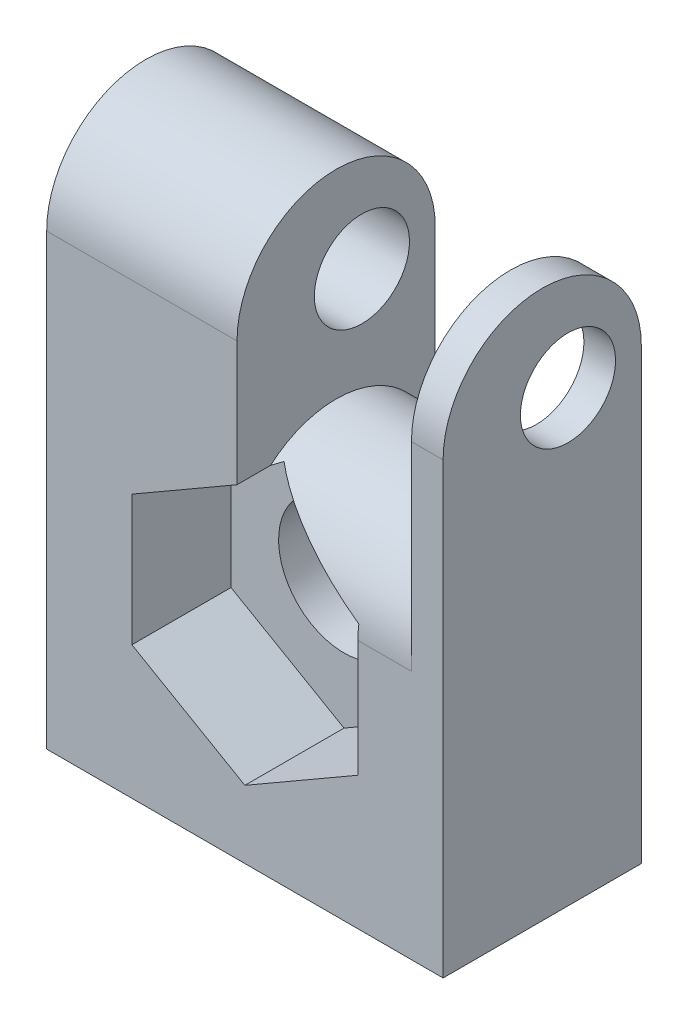
ISO-10303-21;
HEADER;
FILE_DESCRIPTION(('STEP AP214'),'2;1');
FILE_NAME('part.step','',(''),(''),'','','');
FILE_SCHEMA(('AUTOMOTIVE_DESIGN { 1 0 10303 214 1 1 1 1 }'));
ENDSEC;
DATA;
#1=APPLICATION_CONTEXT('core data for automotive mechanical design processes');
#2=APPLICATION_PROTOCOL_DEFINITION('international standard','automotive_design',2000,#1);
#3=PRODUCT_CONTEXT('',#1,'mechanical');
#4=PRODUCT('Part','Part','',(#3));
#5=PRODUCT_RELATED_PRODUCT_CATEGORY('part','',(#4));
#6=PRODUCT_DEFINITION_FORMATION('','',#4);
#7=PRODUCT_DEFINITION_CONTEXT('part definition',#1,'design');
#8=PRODUCT_DEFINITION('design','',#6,#7);
#9=PRODUCT_DEFINITION_SHAPE('','',#8);
#10=(LENGTH_UNIT() NAMED_UNIT(*) SI_UNIT(.MILLI.,.METRE.));
#11=(NAMED_UNIT(*) PLANE_ANGLE_UNIT() SI_UNIT($,.RADIAN.));
#12=(NAMED_UNIT(*) SI_UNIT($,.STERADIAN.) SOLID_ANGLE_UNIT());
#13=UNCERTAINTY_MEASURE_WITH_UNIT(LENGTH_MEASURE(1.E-05),#10,'distance_accuracy_value','');
#14=(GEOMETRIC_REPRESENTATION_CONTEXT(3) GLOBAL_UNCERTAINTY_ASSIGNED_CONTEXT((#13)) GLOBAL_UNIT_ASSIGNED_CONTEXT((#10,
#11,#12)) REPRESENTATION_CONTEXT('',''));
#15=CARTESIAN_POINT('',(0.,0.,0.));
#16=DIRECTION('',(0.,0.,1.));
#17=DIRECTION('',(1.,0.,0.));
#18=AXIS2_PLACEMENT_3D('',#15,#16,#17);
#19=CARTESIAN_POINT('',(0.,0.,0.));
#20=DIRECTION('',(0.,0.,1.));
#21=DIRECTION('',(1.,0.,0.));
#22=AXIS2_PLACEMENT_3D('',#19,#20,#21);
#23=PLANE('',#22);
#24=DIRECTION('',(1.,0.,0.));
#25=VECTOR('',#24,1.);
#26=CARTESIAN_POINT('',(-11.2233690098318,58.061458727347,0.));
#27=LINE('',#26,#25);
#28=CARTESIAN_POINT('',(-0.980271521811472,58.061458727347,0.));
#29=VERTEX_POINT('',#28);
#30=CARTESIAN_POINT('',(2.2051148585505,58.061458727347,0.));
#31=VERTEX_POINT('',#30);
#32=EDGE_CURVE('E285',#29,#31,#27,.T.);
#33=ORIENTED_EDGE('',*,*,#32,.T.);
#34=DIRECTION('',(0.,-1.,0.));
#35=VECTOR('',#34,1.);
#36=CARTESIAN_POINT('',(2.20511485855051,0.,0.));
#37=LINE('',#36,#35);
#38=CARTESIAN_POINT('',(2.2051148585505,63.0790062637207,0.));
#39=VERTEX_POINT('',#38);
#40=EDGE_CURVE('E284',#39,#31,#37,.T.);
#41=ORIENTED_EDGE('',*,*,#40,.F.);
#42=DIRECTION('',(1.,0.,0.));
#43=VECTOR('',#42,1.);
#44=CARTESIAN_POINT('',(-13.2871522145955,63.0790062637207,0.));
#45=LINE('',#44,#43);
#46=CARTESIAN_POINT('',(3.00360840654345,63.0790062637207,0.));
#47=VERTEX_POINT('',#46);
#48=EDGE_CURVE('E255',#39,#47,#45,.T.);
#49=ORIENTED_EDGE('',*,*,#48,.T.);
#50=DIRECTION('',(0.,1.,0.));
#51=VECTOR('',#50,1.);
#52=CARTESIAN_POINT('',(3.00360840654345,0.,0.));
#53=LINE('',#52,#51);
#54=CARTESIAN_POINT('',(3.00360840654345,51.761458727347,0.));
#55=VERTEX_POINT('',#54);
#56=EDGE_CURVE('E189',#55,#47,#53,.T.);
#57=ORIENTED_EDGE('',*,*,#56,.F.);
#58=DIRECTION('',(-1.,0.,0.));
#59=VECTOR('',#58,1.);
#60=CARTESIAN_POINT('',(0.,51.761458727347,0.));
#61=LINE('',#60,#59);
#62=CARTESIAN_POINT('',(-6.99639159345655,51.761458727347,0.));
#63=VERTEX_POINT('',#62);
#64=EDGE_CURVE('E180',#55,#63,#61,.T.);
#65=ORIENTED_EDGE('',*,*,#64,.T.);
#66=DIRECTION('',(0.,1.,0.));
#67=VECTOR('',#66,1.);
#68=CARTESIAN_POINT('',(-6.99639159345655,0.,0.));
#69=LINE('',#68,#67);
#70=CARTESIAN_POINT('',(-6.99639159345655,63.0790062637207,0.));
#71=VERTEX_POINT('',#70);
#72=EDGE_CURVE('E177',#63,#71,#69,.T.);
#73=ORIENTED_EDGE('',*,*,#72,.T.);
#74=CARTESIAN_POINT('',(-2.19488514144951,63.0790062637207,0.));
#75=VERTEX_POINT('',#74);
#76=EDGE_CURVE('E184',#71,#75,#45,.T.);
#77=ORIENTED_EDGE('',*,*,#76,.T.);
#78=DIRECTION('',(0.,-1.,0.));
#79=VECTOR('',#78,1.);
#80=CARTESIAN_POINT('',(-2.1948851414495,0.,0.));
#81=LINE('',#80,#79);
#82=CARTESIAN_POINT('',(-2.19488514144951,58.3994759163304,0.));
#83=VERTEX_POINT('',#82);
#84=EDGE_CURVE('E156',#75,#83,#81,.T.);
#85=ORIENTED_EDGE('',*,*,#84,.T.);
#86=CARTESIAN_POINT('',(-1.99639159345654,56.761458727347,0.));
#87=DIRECTION('',(0.,0.,1.));
#88=DIRECTION('',(1.,0.,0.));
#89=AXIS2_PLACEMENT_3D('',#86,#87,#88);
#90=CIRCLE('',#89,1.65);
#91=EDGE_CURVE('E225',#83,#29,#90,.T.);
#92=ORIENTED_EDGE('',*,*,#91,.T.);
#93=EDGE_LOOP('',(#33,#41,#49,#57,#65,#73,#77,#85,#92));
#94=FACE_BOUND('',#93,.T.);
#95=ADVANCED_FACE('F37',(#94),#23,.F.);
#96=CARTESIAN_POINT('',(0.,0.,5.));
#97=DIRECTION('',(0.,0.,1.));
#98=DIRECTION('',(1.,0.,0.));
#99=AXIS2_PLACEMENT_3D('',#96,#97,#98);
#100=PLANE('',#99);
#101=DIRECTION('',(0.,1.,0.));
#102=VECTOR('',#101,1.);
#103=CARTESIAN_POINT('',(2.2051148585505,63.0790062637212,5.));
#104=LINE('',#103,#102);
#105=CARTESIAN_POINT('',(2.2051148585505,58.061458727347,5.));
#106=VERTEX_POINT('',#105);
#107=CARTESIAN_POINT('',(2.2051148585505,63.0790062637207,5.));
#108=VERTEX_POINT('',#107);
#109=EDGE_CURVE('E259',#106,#108,#104,.T.);
#110=ORIENTED_EDGE('',*,*,#109,.F.);
#111=DIRECTION('',(1.,0.,0.));
#112=VECTOR('',#111,1.);
#113=CARTESIAN_POINT('',(-11.2233690098318,58.061458727347,5.));
#114=LINE('',#113,#112);
#115=CARTESIAN_POINT('',(0.853608406543471,58.061458727347,5.));
#116=VERTEX_POINT('',#115);
#117=EDGE_CURVE('E263',#116,#106,#114,.T.);
#118=ORIENTED_EDGE('',*,*,#117,.F.);
#119=DIRECTION('',(0.,1.,0.));
#120=VECTOR('',#119,1.);
#121=CARTESIAN_POINT('',(0.853608406543471,0.,5.));
#122=LINE('',#121,#120);
#123=CARTESIAN_POINT('',(0.853608406543471,55.1160104601566,5.));
#124=VERTEX_POINT('',#123);
#125=EDGE_CURVE('E202',#124,#116,#122,.T.);
#126=ORIENTED_EDGE('',*,*,#125,.F.);
#127=DIRECTION('',(0.866025403784439,0.5,0.));
#128=VECTOR('',#127,1.);
#129=CARTESIAN_POINT('',(-23.6525305052363,40.9673845626421,5.));
#130=LINE('',#129,#128);
#131=CARTESIAN_POINT('',(-1.99639159345654,53.4705621929661,5.));
#132=VERTEX_POINT('',#131);
#133=EDGE_CURVE('E205',#132,#124,#130,.T.);
#134=ORIENTED_EDGE('',*,*,#133,.F.);
#135=DIRECTION('',(0.866025403784439,-0.499999999999999,0.));
#136=VECTOR('',#135,1.);
#137=CARTESIAN_POINT('',(22.6543347085081,39.2384587268071,5.));
#138=LINE('',#137,#136);
#139=CARTESIAN_POINT('',(-4.84639159345655,55.1160104601566,5.));
#140=VERTEX_POINT('',#139);
#141=EDGE_CURVE('E195',#140,#132,#138,.T.);
#142=ORIENTED_EDGE('',*,*,#141,.F.);
#143=DIRECTION('',(0.,-1.,0.));
#144=VECTOR('',#143,1.);
#145=CARTESIAN_POINT('',(-4.84639159345655,0.,5.));
#146=LINE('',#145,#144);
#147=CARTESIAN_POINT('',(-4.84639159345655,58.4069069945374,5.));
#148=VERTEX_POINT('',#147);
#149=EDGE_CURVE('E198',#148,#140,#146,.T.);
#150=ORIENTED_EDGE('',*,*,#149,.F.);
#151=DIRECTION('',(-0.866025403784438,-0.5,0.));
#152=VECTOR('',#151,1.);
#153=CARTESIAN_POINT('',(-26.5025305052364,45.9037293642134,5.));
#154=LINE('',#153,#152);
#155=CARTESIAN_POINT('',(-2.19488514144951,59.9377549583617,5.));
#156=VERTEX_POINT('',#155);
#157=EDGE_CURVE('E169',#156,#148,#154,.T.);
#158=ORIENTED_EDGE('',*,*,#157,.F.);
#159=DIRECTION('',(0.,1.,0.));
#160=VECTOR('',#159,1.);
#161=CARTESIAN_POINT('',(-2.19488514144951,63.0790062637212,5.));
#162=LINE('',#161,#160);
#163=CARTESIAN_POINT('',(-2.19488514144951,63.0790062637207,5.));
#164=VERTEX_POINT('',#163);
#165=EDGE_CURVE('E153',#156,#164,#162,.T.);
#166=ORIENTED_EDGE('',*,*,#165,.T.);
#167=DIRECTION('',(1.,0.,0.));
#168=VECTOR('',#167,1.);
#169=CARTESIAN_POINT('',(-13.2871522145955,63.0790062637207,5.));
#170=LINE('',#169,#168);
#171=CARTESIAN_POINT('',(-6.99639159345655,63.0790062637207,5.));
#172=VERTEX_POINT('',#171);
#173=EDGE_CURVE('E167',#172,#164,#170,.T.);
#174=ORIENTED_EDGE('',*,*,#173,.F.);
#175=DIRECTION('',(0.,1.,0.));
#176=VECTOR('',#175,1.);
#177=CARTESIAN_POINT('',(-6.99639159345655,0.,5.));
#178=LINE('',#177,#176);
#179=CARTESIAN_POINT('',(-6.99639159345655,51.761458727347,5.));
#180=VERTEX_POINT('',#179);
#181=EDGE_CURVE('E186',#180,#172,#178,.T.);
#182=ORIENTED_EDGE('',*,*,#181,.F.);
#183=DIRECTION('',(-1.,0.,0.));
#184=VECTOR('',#183,1.);
#185=CARTESIAN_POINT('',(0.,51.761458727347,5.));
#186=LINE('',#185,#184);
#187=CARTESIAN_POINT('',(3.00360840654345,51.761458727347,5.));
#188=VERTEX_POINT('',#187);
#189=EDGE_CURVE('E188',#188,#180,#186,.T.);
#190=ORIENTED_EDGE('',*,*,#189,.F.);
#191=DIRECTION('',(0.,1.,0.));
#192=VECTOR('',#191,1.);
#193=CARTESIAN_POINT('',(3.00360840654345,0.,5.));
#194=LINE('',#193,#192);
#195=CARTESIAN_POINT('',(3.00360840654345,63.0790062637207,5.));
#196=VERTEX_POINT('',#195);
#197=EDGE_CURVE('E192',#188,#196,#194,.T.);
#198=ORIENTED_EDGE('',*,*,#197,.T.);
#199=EDGE_CURVE('E178',#108,#196,#170,.T.);
#200=ORIENTED_EDGE('',*,*,#199,.F.);
#201=EDGE_LOOP('',(#110,#118,#126,#134,#142,#150,#158,#166,#174,#182,#190,#198,#200));
#202=FACE_BOUND('',#201,.T.);
#203=ADVANCED_FACE('F165',(#202),#100,.T.);
#204=CARTESIAN_POINT('',(-13.2871522145955,63.0790062637207,2.5));
#205=DIRECTION('',(1.,0.,0.));
#206=DIRECTION('',(0.,0.,-1.));
#207=AXIS2_PLACEMENT_3D('',#204,#205,#206);
#208=CYLINDRICAL_SURFACE('',#207,2.5);
#209=CARTESIAN_POINT('',(2.2051148585505,63.0790062637207,2.5));
#210=DIRECTION('',(-1.,0.,0.));
#211=DIRECTION('',(0.,-1.,0.));
#212=AXIS2_PLACEMENT_3D('',#209,#210,#211);
#213=CIRCLE('',#212,2.5);
#214=EDGE_CURVE('E47',#39,#108,#213,.F.);
#215=ORIENTED_EDGE('',*,*,#214,.T.);
#216=ORIENTED_EDGE('',*,*,#199,.T.);
#217=CARTESIAN_POINT('',(3.00360840654345,63.0790062637207,2.5));
#218=DIRECTION('',(1.,0.,0.));
#219=DIRECTION('',(0.,0.,-1.));
#220=AXIS2_PLACEMENT_3D('',#217,#218,#219);
#221=CIRCLE('',#220,2.5);
#222=EDGE_CURVE('E269',#47,#196,#221,.T.);
#223=ORIENTED_EDGE('',*,*,#222,.F.);
#224=ORIENTED_EDGE('',*,*,#48,.F.);
#225=EDGE_LOOP('',(#215,#216,#223,#224));
#226=FACE_BOUND('',#225,.T.);
#227=ADVANCED_FACE('F252',(#226),#208,.T.);
#228=CARTESIAN_POINT('',(-1.99639159345654,56.761458727347,2.5));
#229=DIRECTION('',(0.,0.,-1.));
#230=DIRECTION('',(-1.,0.,0.));
#231=AXIS2_PLACEMENT_3D('',#228,#229,#230);
#232=CYLINDRICAL_SURFACE('',#231,1.65);
#233=CARTESIAN_POINT('',(-0.980271521811472,58.061458727347,0.));
#234=CARTESIAN_POINT('',(-1.0167469110117,58.089968562406,2.12654652970257E-06));
#235=CARTESIAN_POINT('',(-1.05440058318254,58.1169257307893,0.00048721409174397));
#236=CARTESIAN_POINT('',(-1.13182290707712,58.1675749766456,0.0021243824248191));
#237=CARTESIAN_POINT('',(-1.17159126208777,58.1912675105161,0.00327636986242806));
#238=CARTESIAN_POINT('',(-1.29372981669034,58.257224199395,0.00728493958052973));
#239=CARTESIAN_POINT('',(-1.37892634777902,58.2943618578248,0.0106940130858531));
#240=CARTESIAN_POINT('',(-1.55433334758187,58.3538411818047,0.0169750386161493));
#241=CARTESIAN_POINT('',(-1.64454596644848,58.3761764484616,0.0198467579650277));
#242=CARTESIAN_POINT('',(-1.82735817187807,58.4053734117737,0.0237227410708088));
#243=CARTESIAN_POINT('',(-1.91995199684781,58.4122694484985,0.0247311483475552));
#244=CARTESIAN_POINT('',(-2.04287458594608,58.4110882279547,0.0245704174713448));
#245=CARTESIAN_POINT('',(-2.07338305493721,58.4099448948923,0.0244071929063905));
#246=CARTESIAN_POINT('',(-2.13425266588154,58.4059709498525,0.0238503635143398));
#247=CARTESIAN_POINT('',(-2.16461393682733,58.403142277874,0.023457023583163));
#248=CARTESIAN_POINT('',(-2.19488514144951,58.3994759163304,0.0229565244122687));
#249=B_SPLINE_CURVE_WITH_KNOTS('',3,(#233,#234,#235,#236,#237,#238,#239,#240,#241,#242,#243,
#244,#245,#246,#247,#248),.UNSPECIFIED.,.F.,.F.,(4,2,2,2,2,2,2,4),(0.,0.13879051062977,
0.277561598558075,0.555130663006094,0.832819639037416,1.10989036063432,1.20144697152404,
1.29289839437858),.UNSPECIFIED.);
#250=CARTESIAN_POINT('',(-2.19488514144951,58.3994759163304,0.022956524412269));
#251=VERTEX_POINT('',#250);
#252=EDGE_CURVE('E294',#29,#251,#249,.T.);
#253=ORIENTED_EDGE('',*,*,#252,.F.);
#254=ORIENTED_EDGE('',*,*,#91,.F.);
#255=DIRECTION('',(0.,0.,-1.));
#256=VECTOR('',#255,1.);
#257=CARTESIAN_POINT('',(-2.19488514144951,58.3994759163304,2.5));
#258=LINE('',#257,#256);
#259=EDGE_CURVE('E529',#251,#83,#258,.T.);
#260=ORIENTED_EDGE('',*,*,#259,.F.);
#261=EDGE_LOOP('',(#253,#254,#260));
#262=FACE_BOUND('',#261,.T.);
#263=CARTESIAN_POINT('',(-1.99639159345654,56.761458727347,2.5));
#264=DIRECTION('',(0.,0.,1.));
#265=DIRECTION('',(1.,0.,0.));
#266=AXIS2_PLACEMENT_3D('',#263,#264,#265);
#267=CIRCLE('',#266,1.65);
#268=CARTESIAN_POINT('',(-0.346391593456546,56.761458727347,2.5));
#269=VERTEX_POINT('',#268);
#270=EDGE_CURVE('E228',#269,#269,#267,.T.);
#271=ORIENTED_EDGE('',*,*,#270,.T.);
#272=EDGE_LOOP('',(#271));
#273=FACE_BOUND('',#272,.T.);
#274=ADVANCED_FACE('F39',(#262,#273),#232,.F.);
#275=CARTESIAN_POINT('',(0.,0.,2.5));
#276=DIRECTION('',(0.,0.,1.));
#277=DIRECTION('',(1.,0.,0.));
#278=AXIS2_PLACEMENT_3D('',#275,#276,#277);
#279=PLANE('',#278);
#280=ORIENTED_EDGE('',*,*,#270,.F.);
#281=EDGE_LOOP('',(#280));
#282=FACE_BOUND('',#281,.T.);
#283=DIRECTION('',(0.,-1.,0.));
#284=VECTOR('',#283,1.);
#285=CARTESIAN_POINT('',(-4.84639159345655,0.,2.5));
#286=LINE('',#285,#284);
#287=CARTESIAN_POINT('',(-4.84639159345655,58.4069069945374,2.5));
#288=VERTEX_POINT('',#287);
#289=CARTESIAN_POINT('',(-4.84639159345655,55.1160104601566,2.5));
#290=VERTEX_POINT('',#289);
#291=EDGE_CURVE('E231',#288,#290,#286,.T.);
#292=ORIENTED_EDGE('',*,*,#291,.T.);
#293=DIRECTION('',(0.866025403784439,-0.499999999999999,0.));
#294=VECTOR('',#293,1.);
#295=CARTESIAN_POINT('',(22.6543347085081,39.2384587268071,2.5));
#296=LINE('',#295,#294);
#297=CARTESIAN_POINT('',(-1.99639159345654,53.4705621929661,2.5));
#298=VERTEX_POINT('',#297);
#299=EDGE_CURVE('E62',#290,#298,#296,.T.);
#300=ORIENTED_EDGE('',*,*,#299,.T.);
#301=DIRECTION('',(0.866025403784439,0.5,0.));
#302=VECTOR('',#301,1.);
#303=CARTESIAN_POINT('',(-23.6525305052363,40.9673845626421,2.5));
#304=LINE('',#303,#302);
#305=CARTESIAN_POINT('',(0.853608406543471,55.1160104601566,2.5));
#306=VERTEX_POINT('',#305);
#307=EDGE_CURVE('E235',#298,#306,#304,.T.);
#308=ORIENTED_EDGE('',*,*,#307,.T.);
#309=DIRECTION('',(0.,1.,0.));
#310=VECTOR('',#309,1.);
#311=CARTESIAN_POINT('',(0.853608406543471,0.,2.5));
#312=LINE('',#311,#310);
#313=CARTESIAN_POINT('',(0.853608406543471,58.4069069945374,2.5));
#314=VERTEX_POINT('',#313);
#315=EDGE_CURVE('E238',#306,#314,#312,.T.);
#316=ORIENTED_EDGE('',*,*,#315,.T.);
#317=DIRECTION('',(-0.866025403784439,0.5,0.));
#318=VECTOR('',#317,1.);
#319=CARTESIAN_POINT('',(25.5043347085081,44.1748035283784,2.5));
#320=LINE('',#319,#318);
#321=CARTESIAN_POINT('',(-1.99639159345655,60.0523552617279,2.5));
#322=VERTEX_POINT('',#321);
#323=EDGE_CURVE('E241',#314,#322,#320,.T.);
#324=ORIENTED_EDGE('',*,*,#323,.T.);
#325=DIRECTION('',(-0.866025403784438,-0.5,0.));
#326=VECTOR('',#325,1.);
#327=CARTESIAN_POINT('',(-26.5025305052364,45.9037293642134,2.5));
#328=LINE('',#327,#326);
#329=EDGE_CURVE('E244',#322,#288,#328,.T.);
#330=ORIENTED_EDGE('',*,*,#329,.T.);
#331=EDGE_LOOP('',(#292,#300,#308,#316,#324,#330));
#332=FACE_BOUND('',#331,.T.);
#333=ADVANCED_FACE('F351',(#282,#332),#279,.T.);
#334=CARTESIAN_POINT('',(22.6543347085081,39.2384587268071,5.));
#335=DIRECTION('',(0.499999999999999,0.866025403784439,0.));
#336=DIRECTION('',(-0.866025403784439,0.499999999999999,0.));
#337=AXIS2_PLACEMENT_3D('',#334,#335,#336);
#338=PLANE('',#337);
#339=DIRECTION('',(0.,0.,-1.));
#340=VECTOR('',#339,1.);
#341=CARTESIAN_POINT('',(-1.99639159345654,53.4705621929661,5.));
#342=LINE('',#341,#340);
#343=EDGE_CURVE('E212',#132,#298,#342,.T.);
#344=ORIENTED_EDGE('',*,*,#343,.T.);
#345=ORIENTED_EDGE('',*,*,#299,.F.);
#346=DIRECTION('',(0.,0.,-1.));
#347=VECTOR('',#346,1.);
#348=CARTESIAN_POINT('',(-4.84639159345655,55.1160104601566,5.));
#349=LINE('',#348,#347);
#350=EDGE_CURVE('E223',#140,#290,#349,.T.);
#351=ORIENTED_EDGE('',*,*,#350,.F.);
#352=ORIENTED_EDGE('',*,*,#141,.T.);
#353=EDGE_LOOP('',(#344,#345,#351,#352));
#354=FACE_BOUND('',#353,.T.);
#355=ADVANCED_FACE('F347',(#354),#338,.T.);
#356=CARTESIAN_POINT('',(-4.84639159345655,0.,5.));
#357=DIRECTION('',(1.,0.,0.));
#358=DIRECTION('',(0.,0.,-1.));
#359=AXIS2_PLACEMENT_3D('',#356,#357,#358);
#360=PLANE('',#359);
#361=ORIENTED_EDGE('',*,*,#350,.T.);
#362=ORIENTED_EDGE('',*,*,#291,.F.);
#363=DIRECTION('',(0.,0.,-1.));
#364=VECTOR('',#363,1.);
#365=CARTESIAN_POINT('',(-4.84639159345655,58.4069069945374,5.));
#366=LINE('',#365,#364);
#367=EDGE_CURVE('E220',#148,#288,#366,.T.);
#368=ORIENTED_EDGE('',*,*,#367,.F.);
#369=ORIENTED_EDGE('',*,*,#149,.T.);
#370=EDGE_LOOP('',(#361,#362,#368,#369));
#371=FACE_BOUND('',#370,.T.);
#372=ADVANCED_FACE('F343',(#371),#360,.T.);
#373=CARTESIAN_POINT('',(-26.5025305052364,45.9037293642134,5.));
#374=DIRECTION('',(0.500000000000001,-0.866025403784438,0.));
#375=DIRECTION('',(0.866025403784438,0.500000000000001,0.));
#376=AXIS2_PLACEMENT_3D('',#373,#374,#375);
#377=PLANE('',#376);
#378=CARTESIAN_POINT('',(-5.44472554361699,58.061458727347,2.5));
#379=DIRECTION('',(0.500000000000001,-0.866025403784438,0.));
#380=DIRECTION('',(0.866025403784438,0.500000000000001,0.));
#381=AXIS2_PLACEMENT_3D('',#378,#379,#380);
#382=ELLIPSE('',#381,5.,2.5);
#383=CARTESIAN_POINT('',(-2.19488514144951,59.9377549583617,4.1521236193094));
#384=VERTEX_POINT('',#383);
#385=CARTESIAN_POINT('',(-1.99639159345655,60.0523552617279,4.01206183385148));
#386=VERTEX_POINT('',#385);
#387=EDGE_CURVE('E303',#384,#386,#382,.F.);
#388=ORIENTED_EDGE('',*,*,#387,.F.);
#389=DIRECTION('',(0.,0.,-1.));
#390=VECTOR('',#389,1.);
#391=CARTESIAN_POINT('',(-2.19488514144951,59.9377549583617,5.));
#392=LINE('',#391,#390);
#393=EDGE_CURVE('E170',#156,#384,#392,.T.);
#394=ORIENTED_EDGE('',*,*,#393,.F.);
#395=ORIENTED_EDGE('',*,*,#157,.T.);
#396=ORIENTED_EDGE('',*,*,#367,.T.);
#397=ORIENTED_EDGE('',*,*,#329,.F.);
#398=DIRECTION('',(0.,0.,-1.));
#399=VECTOR('',#398,1.);
#400=CARTESIAN_POINT('',(-1.99639159345655,60.0523552617279,5.));
#401=LINE('',#400,#399);
#402=EDGE_CURVE('E218',#386,#322,#401,.T.);
#403=ORIENTED_EDGE('',*,*,#402,.F.);
#404=EDGE_LOOP('',(#388,#394,#395,#396,#397,#403));
#405=FACE_BOUND('',#404,.T.);
#406=ADVANCED_FACE('F339',(#405),#377,.T.);
#407=CARTESIAN_POINT('',(25.5043347085081,44.1748035283784,5.));
#408=DIRECTION('',(-0.5,-0.866025403784438,0.));
#409=DIRECTION('',(0.866025403784439,-0.5,0.));
#410=AXIS2_PLACEMENT_3D('',#407,#408,#409);
#411=PLANE('',#410);
#412=CARTESIAN_POINT('',(1.45194235670389,58.061458727347,2.5));
#413=DIRECTION('',(-0.5,-0.866025403784438,0.));
#414=DIRECTION('',(0.866025403784439,-0.5,0.));
#415=AXIS2_PLACEMENT_3D('',#412,#413,#414);
#416=ELLIPSE('',#415,5.,2.5);
#417=CARTESIAN_POINT('',(0.853608406543471,58.4069069945374,4.97601807236844));
#418=VERTEX_POINT('',#417);
#419=EDGE_CURVE('E536',#386,#418,#416,.F.);
#420=ORIENTED_EDGE('',*,*,#419,.F.);
#421=ORIENTED_EDGE('',*,*,#402,.T.);
#422=ORIENTED_EDGE('',*,*,#323,.F.);
#423=DIRECTION('',(0.,0.,-1.));
#424=VECTOR('',#423,1.);
#425=CARTESIAN_POINT('',(0.853608406543471,58.4069069945374,5.));
#426=LINE('',#425,#424);
#427=EDGE_CURVE('E216',#418,#314,#426,.T.);
#428=ORIENTED_EDGE('',*,*,#427,.F.);
#429=EDGE_LOOP('',(#420,#421,#422,#428));
#430=FACE_BOUND('',#429,.T.);
#431=ADVANCED_FACE('F335',(#430),#411,.T.);
#432=CARTESIAN_POINT('',(0.853608406543471,0.,5.));
#433=DIRECTION('',(-1.,0.,0.));
#434=DIRECTION('',(0.,0.,1.));
#435=AXIS2_PLACEMENT_3D('',#432,#433,#434);
#436=PLANE('',#435);
#437=CARTESIAN_POINT('',(0.853608406543471,58.061458727347,2.5));
#438=DIRECTION('',(-1.,0.,0.));
#439=DIRECTION('',(0.,0.,1.));
#440=AXIS2_PLACEMENT_3D('',#437,#438,#439);
#441=CIRCLE('',#440,2.5);
#442=EDGE_CURVE('E531',#418,#116,#441,.F.);
#443=ORIENTED_EDGE('',*,*,#442,.F.);
#444=ORIENTED_EDGE('',*,*,#427,.T.);
#445=ORIENTED_EDGE('',*,*,#315,.F.);
#446=DIRECTION('',(0.,0.,-1.));
#447=VECTOR('',#446,1.);
#448=CARTESIAN_POINT('',(0.853608406543471,55.1160104601566,5.));
#449=LINE('',#448,#447);
#450=EDGE_CURVE('E54',#124,#306,#449,.T.);
#451=ORIENTED_EDGE('',*,*,#450,.F.);
#452=ORIENTED_EDGE('',*,*,#125,.T.);
#453=EDGE_LOOP('',(#443,#444,#445,#451,#452));
#454=FACE_BOUND('',#453,.T.);
#455=ADVANCED_FACE('F332',(#454),#436,.T.);
#456=CARTESIAN_POINT('',(-6.99639159345655,0.,5.));
#457=DIRECTION('',(-1.,0.,0.));
#458=DIRECTION('',(0.,0.,1.));
#459=AXIS2_PLACEMENT_3D('',#456,#457,#458);
#460=PLANE('',#459);
#461=ORIENTED_EDGE('',*,*,#72,.F.);
#462=DIRECTION('',(0.,0.,-1.));
#463=VECTOR('',#462,1.);
#464=CARTESIAN_POINT('',(-6.99639159345655,51.761458727347,5.));
#465=LINE('',#464,#463);
#466=EDGE_CURVE('E214',#180,#63,#465,.T.);
#467=ORIENTED_EDGE('',*,*,#466,.F.);
#468=ORIENTED_EDGE('',*,*,#181,.T.);
#469=CARTESIAN_POINT('',(-6.99639159345655,63.0790062637207,2.5));
#470=DIRECTION('',(-1.,0.,0.));
#471=DIRECTION('',(0.,0.,1.));
#472=AXIS2_PLACEMENT_3D('',#469,#470,#471);
#473=CIRCLE('',#472,2.5);
#474=EDGE_CURVE('E176',#71,#172,#473,.F.);
#475=ORIENTED_EDGE('',*,*,#474,.F.);
#476=EDGE_LOOP('',(#461,#467,#468,#475));
#477=FACE_BOUND('',#476,.T.);
#478=ADVANCED_FACE('F281',(#477),#460,.T.);
#479=CARTESIAN_POINT('',(0.,51.761458727347,5.));
#480=DIRECTION('',(0.,-1.,0.));
#481=DIRECTION('',(0.,0.,-1.));
#482=AXIS2_PLACEMENT_3D('',#479,#480,#481);
#483=PLANE('',#482);
#484=ORIENTED_EDGE('',*,*,#64,.F.);
#485=DIRECTION('',(0.,0.,-1.));
#486=VECTOR('',#485,1.);
#487=CARTESIAN_POINT('',(3.00360840654345,51.761458727347,5.));
#488=LINE('',#487,#486);
#489=EDGE_CURVE('E206',#188,#55,#488,.T.);
#490=ORIENTED_EDGE('',*,*,#489,.F.);
#491=ORIENTED_EDGE('',*,*,#189,.T.);
#492=ORIENTED_EDGE('',*,*,#466,.T.);
#493=EDGE_LOOP('',(#484,#490,#491,#492));
#494=FACE_BOUND('',#493,.T.);
#495=ADVANCED_FACE('F283',(#494),#483,.T.);
#496=CARTESIAN_POINT('',(3.00360840654345,0.,5.));
#497=DIRECTION('',(-1.,0.,0.));
#498=DIRECTION('',(0.,0.,1.));
#499=AXIS2_PLACEMENT_3D('',#496,#497,#498);
#500=PLANE('',#499);
#501=CARTESIAN_POINT('',(3.00360840654345,63.0790062637212,1.85000000000002));
#502=DIRECTION('',(-1.,0.,0.));
#503=DIRECTION('',(0.,0.,1.));
#504=AXIS2_PLACEMENT_3D('',#501,#502,#503);
#505=CIRCLE('',#504,1.2);
#506=CARTESIAN_POINT('',(3.00360840654345,63.0790062637212,3.05000000000002));
#507=VERTEX_POINT('',#506);
#508=EDGE_CURVE('E42',#507,#507,#505,.T.);
#509=ORIENTED_EDGE('',*,*,#508,.T.);
#510=EDGE_LOOP('',(#509));
#511=FACE_BOUND('',#510,.T.);
#512=ORIENTED_EDGE('',*,*,#56,.T.);
#513=ORIENTED_EDGE('',*,*,#222,.T.);
#514=ORIENTED_EDGE('',*,*,#197,.F.);
#515=ORIENTED_EDGE('',*,*,#489,.T.);
#516=EDGE_LOOP('',(#512,#513,#514,#515));
#517=FACE_BOUND('',#516,.T.);
#518=ADVANCED_FACE('F270',(#511,#517),#500,.F.);
#519=CARTESIAN_POINT('',(-23.6525305052363,40.9673845626421,5.));
#520=DIRECTION('',(-0.5,0.866025403784439,0.));
#521=DIRECTION('',(-0.866025403784439,-0.5,0.));
#522=AXIS2_PLACEMENT_3D('',#519,#520,#521);
#523=PLANE('',#522);
#524=ORIENTED_EDGE('',*,*,#450,.T.);
#525=ORIENTED_EDGE('',*,*,#307,.F.);
#526=ORIENTED_EDGE('',*,*,#343,.F.);
#527=ORIENTED_EDGE('',*,*,#133,.T.);
#528=EDGE_LOOP('',(#524,#525,#526,#527));
#529=FACE_BOUND('',#528,.T.);
#530=ADVANCED_FACE('F327',(#529),#523,.T.);
#531=ORIENTED_EDGE('',*,*,#173,.T.);
#532=CARTESIAN_POINT('',(-2.19488514144951,63.0790062637207,2.5));
#533=DIRECTION('',(-1.,0.,0.));
#534=DIRECTION('',(0.,-1.,0.));
#535=AXIS2_PLACEMENT_3D('',#532,#533,#534);
#536=CIRCLE('',#535,2.5);
#537=EDGE_CURVE('E11',#75,#164,#536,.F.);
#538=ORIENTED_EDGE('',*,*,#537,.F.);
#539=ORIENTED_EDGE('',*,*,#76,.F.);
#540=ORIENTED_EDGE('',*,*,#474,.T.);
#541=EDGE_LOOP('',(#531,#538,#539,#540));
#542=FACE_BOUND('',#541,.T.);
#543=ADVANCED_FACE('F174',(#542),#208,.T.);
#544=CARTESIAN_POINT('',(4.0051148585505,63.0790062637212,1.85000000000002));
#545=DIRECTION('',(-1.,0.,0.));
#546=DIRECTION('',(0.,-0.00269153146870469,-0.999996377822616));
#547=AXIS2_PLACEMENT_3D('',#544,#545,#546);
#548=CYLINDRICAL_SURFACE('',#547,1.2);
#549=CARTESIAN_POINT('',(2.2051148585505,63.0790062637212,1.85000000000002));
#550=DIRECTION('',(-1.,0.,0.));
#551=DIRECTION('',(0.,-1.,0.));
#552=AXIS2_PLACEMENT_3D('',#549,#550,#551);
#553=CIRCLE('',#552,1.2);
#554=CARTESIAN_POINT('',(2.2051148585505,61.8790062637212,1.85000000000002));
#555=VERTEX_POINT('',#554);
#556=EDGE_CURVE('E288',#555,#555,#553,.T.);
#557=ORIENTED_EDGE('',*,*,#556,.T.);
#558=EDGE_LOOP('',(#557));
#559=FACE_BOUND('',#558,.T.);
#560=ORIENTED_EDGE('',*,*,#508,.F.);
#561=EDGE_LOOP('',(#560));
#562=FACE_BOUND('',#561,.T.);
#563=ADVANCED_FACE('F313',(#559,#562),#548,.F.);
#564=CARTESIAN_POINT('',(-2.19488514144951,63.0790062637212,1.85000000000002));
#565=DIRECTION('',(-1.,0.,0.));
#566=DIRECTION('',(0.,-0.00269153146870469,-0.999996377822616));
#567=AXIS2_PLACEMENT_3D('',#564,#565,#566);
#568=PLANE('',#567);
#569=CARTESIAN_POINT('',(-2.19488514144951,63.0790062637212,1.85000000000002));
#570=DIRECTION('',(-1.,0.,0.));
#571=DIRECTION('',(0.,-1.,0.));
#572=AXIS2_PLACEMENT_3D('',#569,#570,#571);
#573=CIRCLE('',#572,1.2);
#574=CARTESIAN_POINT('',(-2.19488514144951,61.8790062637212,1.85000000000002));
#575=VERTEX_POINT('',#574);
#576=EDGE_CURVE('E286',#575,#575,#573,.T.);
#577=ORIENTED_EDGE('',*,*,#576,.T.);
#578=EDGE_LOOP('',(#577));
#579=FACE_BOUND('',#578,.T.);
#580=ORIENTED_EDGE('',*,*,#537,.T.);
#581=ORIENTED_EDGE('',*,*,#165,.F.);
#582=ORIENTED_EDGE('',*,*,#393,.T.);
#583=CARTESIAN_POINT('',(-2.19488514144951,58.061458727347,2.5));
#584=DIRECTION('',(-1.,0.,0.));
#585=DIRECTION('',(0.,-1.,0.));
#586=AXIS2_PLACEMENT_3D('',#583,#584,#585);
#587=CIRCLE('',#586,2.5);
#588=EDGE_CURVE('E539',#384,#251,#587,.T.);
#589=ORIENTED_EDGE('',*,*,#588,.T.);
#590=ORIENTED_EDGE('',*,*,#259,.T.);
#591=ORIENTED_EDGE('',*,*,#84,.F.);
#592=EDGE_LOOP('',(#580,#581,#582,#589,#590,#591));
#593=FACE_BOUND('',#592,.T.);
#594=ADVANCED_FACE('F152',(#579,#593),#568,.F.);
#595=CARTESIAN_POINT('',(2.2051148585505,63.0790062637212,1.85000000000002));
#596=DIRECTION('',(-1.,0.,0.));
#597=DIRECTION('',(0.,-0.00269153146870469,-0.999996377822616));
#598=AXIS2_PLACEMENT_3D('',#595,#596,#597);
#599=PLANE('',#598);
#600=ORIENTED_EDGE('',*,*,#556,.F.);
#601=EDGE_LOOP('',(#600));
#602=FACE_BOUND('',#601,.T.);
#603=ORIENTED_EDGE('',*,*,#40,.T.);
#604=CARTESIAN_POINT('',(2.2051148585505,58.061458727347,2.5));
#605=DIRECTION('',(-1.,0.,0.));
#606=DIRECTION('',(0.,-1.,0.));
#607=AXIS2_PLACEMENT_3D('',#604,#605,#606);
#608=CIRCLE('',#607,2.5);
#609=EDGE_CURVE('E171',#106,#31,#608,.T.);
#610=ORIENTED_EDGE('',*,*,#609,.F.);
#611=ORIENTED_EDGE('',*,*,#109,.T.);
#612=ORIENTED_EDGE('',*,*,#214,.F.);
#613=EDGE_LOOP('',(#603,#610,#611,#612));
#614=FACE_BOUND('',#613,.T.);
#615=ADVANCED_FACE('F260',(#602,#614),#599,.T.);
#616=ORIENTED_EDGE('',*,*,#576,.F.);
#617=EDGE_LOOP('',(#616));
#618=FACE_BOUND('',#617,.T.);
#619=CARTESIAN_POINT('',(-4.19488514144951,63.0790062637212,1.85000000000002));
#620=DIRECTION('',(-1.,0.,0.));
#621=DIRECTION('',(0.,-1.,0.));
#622=AXIS2_PLACEMENT_3D('',#619,#620,#621);
#623=CIRCLE('',#622,1.2);
#624=CARTESIAN_POINT('',(-4.19488514144951,61.8790062637212,1.85000000000002));
#625=VERTEX_POINT('',#624);
#626=EDGE_CURVE('E291',#625,#625,#623,.T.);
#627=ORIENTED_EDGE('',*,*,#626,.T.);
#628=EDGE_LOOP('',(#627));
#629=FACE_BOUND('',#628,.T.);
#630=ADVANCED_FACE('F317',(#618,#629),#548,.F.);
#631=CARTESIAN_POINT('',(-4.19488514144952,113.60740925965,6.76401901272162));
#632=DIRECTION('',(-1.,0.,0.));
#633=DIRECTION('',(0.,-0.00269153146870469,-0.999996377822616));
#634=AXIS2_PLACEMENT_3D('',#631,#632,#633);
#635=PLANE('',#634);
#636=ORIENTED_EDGE('',*,*,#626,.F.);
#637=EDGE_LOOP('',(#636));
#638=FACE_BOUND('',#637,.T.);
#639=ADVANCED_FACE('F309',(#638),#635,.F.);
#640=CARTESIAN_POINT('',(-11.2233690098318,58.061458727347,2.5));
#641=DIRECTION('',(1.,0.,0.));
#642=DIRECTION('',(0.,0.,-1.));
#643=AXIS2_PLACEMENT_3D('',#640,#641,#642);
#644=CYLINDRICAL_SURFACE('',#643,2.5);
#645=ORIENTED_EDGE('',*,*,#252,.T.);
#646=ORIENTED_EDGE('',*,*,#588,.F.);
#647=ORIENTED_EDGE('',*,*,#387,.T.);
#648=ORIENTED_EDGE('',*,*,#419,.T.);
#649=ORIENTED_EDGE('',*,*,#442,.T.);
#650=ORIENTED_EDGE('',*,*,#117,.T.);
#651=ORIENTED_EDGE('',*,*,#609,.T.);
#652=ORIENTED_EDGE('',*,*,#32,.F.);
#653=EDGE_LOOP('',(#645,#646,#647,#648,#649,#650,#651,#652));
#654=FACE_BOUND('',#653,.T.);
#655=ADVANCED_FACE('F305',(#654),#644,.T.);
#656=CLOSED_SHELL('',(#95,#203,#227,#274,#333,#355,#372,#406,#431,#455,#478,#495,#518,#530,#543,
#563,#594,#615,#630,#639,#655));
#657=MANIFOLD_SOLID_BREP('B2',#656);
#658=ADVANCED_BREP_SHAPE_REPRESENTATION('',(#18,#657),#14);
#659=SHAPE_DEFINITION_REPRESENTATION(#9,#658);
ENDSEC;
END-ISO-10303-21;
